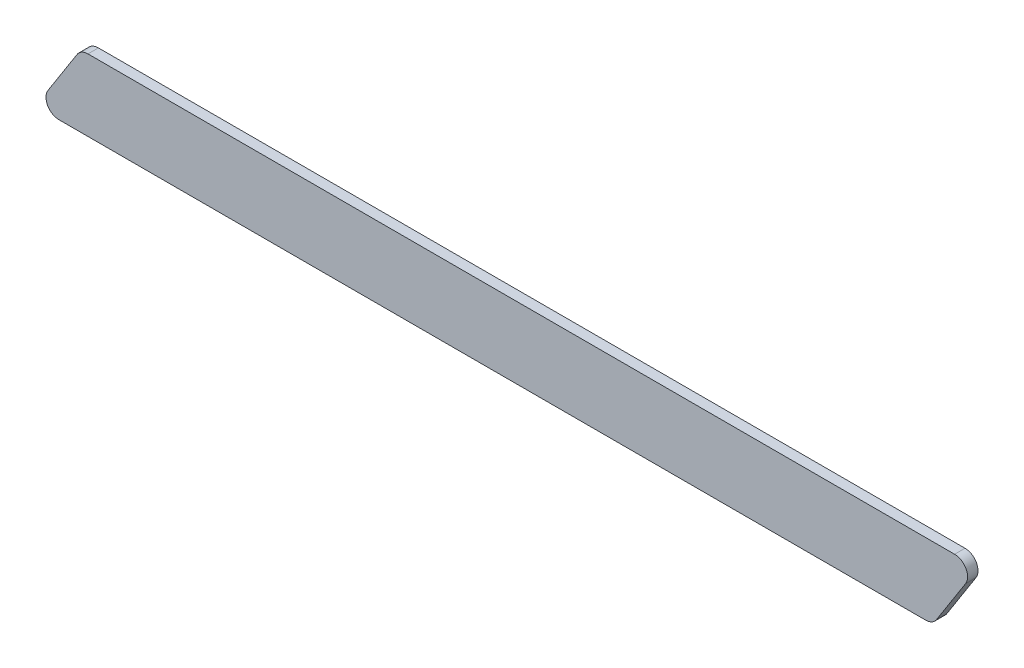
ISO-10303-21;
HEADER;
FILE_DESCRIPTION(('STEP AP214'),'2;1');
FILE_NAME('part.step','',(''),(''),'','','');
FILE_SCHEMA(('AUTOMOTIVE_DESIGN { 1 0 10303 214 1 1 1 1 }'));
ENDSEC;
DATA;
#1=APPLICATION_CONTEXT('core data for automotive mechanical design processes');
#2=APPLICATION_PROTOCOL_DEFINITION('international standard','automotive_design',2000,#1);
#3=PRODUCT_CONTEXT('',#1,'mechanical');
#4=PRODUCT('Part','Part','',(#3));
#5=PRODUCT_RELATED_PRODUCT_CATEGORY('part','',(#4));
#6=PRODUCT_DEFINITION_FORMATION('','',#4);
#7=PRODUCT_DEFINITION_CONTEXT('part definition',#1,'design');
#8=PRODUCT_DEFINITION('design','',#6,#7);
#9=PRODUCT_DEFINITION_SHAPE('','',#8);
#10=(LENGTH_UNIT() NAMED_UNIT(*) SI_UNIT(.MILLI.,.METRE.));
#11=(NAMED_UNIT(*) PLANE_ANGLE_UNIT() SI_UNIT($,.RADIAN.));
#12=(NAMED_UNIT(*) SI_UNIT($,.STERADIAN.) SOLID_ANGLE_UNIT());
#13=UNCERTAINTY_MEASURE_WITH_UNIT(LENGTH_MEASURE(1.E-05),#10,'distance_accuracy_value','');
#14=(GEOMETRIC_REPRESENTATION_CONTEXT(3) GLOBAL_UNCERTAINTY_ASSIGNED_CONTEXT((#13)) GLOBAL_UNIT_ASSIGNED_CONTEXT((#10,
#11,#12)) REPRESENTATION_CONTEXT('',''));
#15=CARTESIAN_POINT('',(0.,0.,0.));
#16=DIRECTION('',(0.,0.,1.));
#17=DIRECTION('',(1.,0.,0.));
#18=AXIS2_PLACEMENT_3D('',#15,#16,#17);
#19=CARTESIAN_POINT('',(-72.5,5.5,1.6));
#20=DIRECTION('',(0.,-1.,0.));
#21=DIRECTION('',(0.,0.,-1.));
#22=AXIS2_PLACEMENT_3D('',#19,#20,#21);
#23=PLANE('',#22);
#24=DIRECTION('',(-1.,0.,0.));
#25=VECTOR('',#24,1.);
#26=CARTESIAN_POINT('',(-72.5,5.5,1.6));
#27=LINE('',#26,#25);
#28=CARTESIAN_POINT('',(68.8566536708353,5.5,1.6));
#29=VERTEX_POINT('',#28);
#30=CARTESIAN_POINT('',(-64.4021082162899,5.5,1.6));
#31=VERTEX_POINT('',#30);
#32=EDGE_CURVE('E126',#29,#31,#27,.T.);
#33=ORIENTED_EDGE('',*,*,#32,.F.);
#34=DIRECTION('',(0.,0.,-1.));
#35=VECTOR('',#34,1.);
#36=CARTESIAN_POINT('',(68.8566536708353,5.5,1.6));
#37=LINE('',#36,#35);
#38=CARTESIAN_POINT('',(68.8566536708353,5.5,0.));
#39=VERTEX_POINT('',#38);
#40=EDGE_CURVE('E110',#29,#39,#37,.T.);
#41=ORIENTED_EDGE('',*,*,#40,.T.);
#42=DIRECTION('',(-1.,0.,0.));
#43=VECTOR('',#42,1.);
#44=CARTESIAN_POINT('',(-72.5,5.5,0.));
#45=LINE('',#44,#43);
#46=CARTESIAN_POINT('',(-64.4021082162899,5.5,0.));
#47=VERTEX_POINT('',#46);
#48=EDGE_CURVE('E123',#39,#47,#45,.T.);
#49=ORIENTED_EDGE('',*,*,#48,.T.);
#50=DIRECTION('',(0.,0.,1.));
#51=VECTOR('',#50,1.);
#52=CARTESIAN_POINT('',(-64.4021082162899,5.5,1.6));
#53=LINE('',#52,#51);
#54=EDGE_CURVE('E128',#47,#31,#53,.T.);
#55=ORIENTED_EDGE('',*,*,#54,.T.);
#56=EDGE_LOOP('',(#33,#41,#49,#55));
#57=FACE_BOUND('',#56,.T.);
#58=ADVANCED_FACE('F39',(#57),#23,.F.);
#59=CARTESIAN_POINT('',(-72.5,-5.5,1.6));
#60=DIRECTION('',(0.,1.,0.));
#61=DIRECTION('',(0.,0.,1.));
#62=AXIS2_PLACEMENT_3D('',#59,#60,#61);
#63=PLANE('',#62);
#64=DIRECTION('',(1.,0.,0.));
#65=VECTOR('',#64,1.);
#66=CARTESIAN_POINT('',(-72.5,-5.5,0.));
#67=LINE('',#66,#65);
#68=CARTESIAN_POINT('',(-68.8566536708354,-5.5,0.));
#69=VERTEX_POINT('',#68);
#70=CARTESIAN_POINT('',(64.4021082162899,-5.5,0.));
#71=VERTEX_POINT('',#70);
#72=EDGE_CURVE('E133',#69,#71,#67,.T.);
#73=ORIENTED_EDGE('',*,*,#72,.T.);
#74=DIRECTION('',(0.,0.,1.));
#75=VECTOR('',#74,1.);
#76=CARTESIAN_POINT('',(64.4021082162899,-5.5,1.6));
#77=LINE('',#76,#75);
#78=CARTESIAN_POINT('',(64.4021082162899,-5.5,1.6));
#79=VERTEX_POINT('',#78);
#80=EDGE_CURVE('E160',#71,#79,#77,.T.);
#81=ORIENTED_EDGE('',*,*,#80,.T.);
#82=DIRECTION('',(1.,0.,0.));
#83=VECTOR('',#82,1.);
#84=CARTESIAN_POINT('',(-72.5,-5.5,1.6));
#85=LINE('',#84,#83);
#86=CARTESIAN_POINT('',(-68.8566536708354,-5.5,1.6));
#87=VERTEX_POINT('',#86);
#88=EDGE_CURVE('E141',#87,#79,#85,.T.);
#89=ORIENTED_EDGE('',*,*,#88,.F.);
#90=DIRECTION('',(0.,0.,-1.));
#91=VECTOR('',#90,1.);
#92=CARTESIAN_POINT('',(-68.8566536708354,-5.5,1.6));
#93=LINE('',#92,#91);
#94=EDGE_CURVE('E157',#87,#69,#93,.T.);
#95=ORIENTED_EDGE('',*,*,#94,.T.);
#96=EDGE_LOOP('',(#73,#81,#89,#95));
#97=FACE_BOUND('',#96,.T.);
#98=ADVANCED_FACE('F182',(#97),#63,.F.);
#99=CARTESIAN_POINT('',(0.,0.,1.6));
#100=DIRECTION('',(0.,0.,-1.));
#101=DIRECTION('',(-1.,0.,0.));
#102=AXIS2_PLACEMENT_3D('',#99,#100,#101);
#103=PLANE('',#102);
#104=DIRECTION('',(-0.53687549219316,-0.843661487732107,0.));
#105=VECTOR('',#104,1.);
#106=CARTESIAN_POINT('',(72.5,5.5,1.6));
#107=LINE('',#106,#105);
#108=CARTESIAN_POINT('',(70.5439766462996,2.42624901561367,1.6));
#109=VERTEX_POINT('',#108);
#110=CARTESIAN_POINT('',(66.0894311917541,-4.57375098438633,1.6));
#111=VERTEX_POINT('',#110);
#112=EDGE_CURVE('E174',#109,#111,#107,.T.);
#113=ORIENTED_EDGE('',*,*,#112,.F.);
#114=CARTESIAN_POINT('',(68.8566536708353,3.5,1.6));
#115=DIRECTION('',(0.,0.,-1.));
#116=DIRECTION('',(-1.,0.,0.));
#117=AXIS2_PLACEMENT_3D('',#114,#115,#116);
#118=CIRCLE('',#117,2.);
#119=EDGE_CURVE('E155',#109,#29,#118,.F.);
#120=ORIENTED_EDGE('',*,*,#119,.T.);
#121=ORIENTED_EDGE('',*,*,#32,.T.);
#122=CARTESIAN_POINT('',(-64.4021082162899,3.5,1.6));
#123=DIRECTION('',(0.,0.,-1.));
#124=DIRECTION('',(-1.,0.,0.));
#125=AXIS2_PLACEMENT_3D('',#122,#123,#124);
#126=CIRCLE('',#125,2.);
#127=CARTESIAN_POINT('',(-66.0894311917542,4.57375098438633,1.6));
#128=VERTEX_POINT('',#127);
#129=EDGE_CURVE('E151',#31,#128,#126,.F.);
#130=ORIENTED_EDGE('',*,*,#129,.T.);
#131=DIRECTION('',(0.53687549219316,0.843661487732107,0.));
#132=VECTOR('',#131,1.);
#133=CARTESIAN_POINT('',(-72.5,-5.5,1.6));
#134=LINE('',#133,#132);
#135=CARTESIAN_POINT('',(-70.5439766462996,-2.42624901561368,1.6));
#136=VERTEX_POINT('',#135);
#137=EDGE_CURVE('E138',#136,#128,#134,.T.);
#138=ORIENTED_EDGE('',*,*,#137,.F.);
#139=CARTESIAN_POINT('',(-68.8566536708354,-3.5,1.6));
#140=DIRECTION('',(0.,0.,-1.));
#141=DIRECTION('',(-1.,0.,0.));
#142=AXIS2_PLACEMENT_3D('',#139,#140,#141);
#143=CIRCLE('',#142,2.);
#144=EDGE_CURVE('E62',#136,#87,#143,.F.);
#145=ORIENTED_EDGE('',*,*,#144,.T.);
#146=ORIENTED_EDGE('',*,*,#88,.T.);
#147=CARTESIAN_POINT('',(64.4021082162899,-3.5,1.6));
#148=DIRECTION('',(0.,0.,-1.));
#149=DIRECTION('',(-1.,0.,0.));
#150=AXIS2_PLACEMENT_3D('',#147,#148,#149);
#151=CIRCLE('',#150,2.);
#152=EDGE_CURVE('E54',#79,#111,#151,.F.);
#153=ORIENTED_EDGE('',*,*,#152,.T.);
#154=EDGE_LOOP('',(#113,#120,#121,#130,#138,#145,#146,#153));
#155=FACE_BOUND('',#154,.T.);
#156=ADVANCED_FACE('F170',(#155),#103,.F.);
#157=CARTESIAN_POINT('',(0.,0.,0.));
#158=DIRECTION('',(0.,0.,-1.));
#159=DIRECTION('',(-1.,0.,0.));
#160=AXIS2_PLACEMENT_3D('',#157,#158,#159);
#161=PLANE('',#160);
#162=ORIENTED_EDGE('',*,*,#48,.F.);
#163=CARTESIAN_POINT('',(68.8566536708353,3.5,0.));
#164=DIRECTION('',(0.,0.,-1.));
#165=DIRECTION('',(-1.,0.,0.));
#166=AXIS2_PLACEMENT_3D('',#163,#164,#165);
#167=CIRCLE('',#166,2.);
#168=CARTESIAN_POINT('',(70.5439766462996,2.42624901561367,0.));
#169=VERTEX_POINT('',#168);
#170=EDGE_CURVE('E106',#39,#169,#167,.T.);
#171=ORIENTED_EDGE('',*,*,#170,.T.);
#172=DIRECTION('',(-0.53687549219316,-0.843661487732107,0.));
#173=VECTOR('',#172,1.);
#174=CARTESIAN_POINT('',(72.5,5.5,0.));
#175=LINE('',#174,#173);
#176=CARTESIAN_POINT('',(66.0894311917541,-4.57375098438633,0.));
#177=VERTEX_POINT('',#176);
#178=EDGE_CURVE('E172',#169,#177,#175,.T.);
#179=ORIENTED_EDGE('',*,*,#178,.T.);
#180=CARTESIAN_POINT('',(64.4021082162899,-3.5,0.));
#181=DIRECTION('',(0.,0.,-1.));
#182=DIRECTION('',(-1.,0.,0.));
#183=AXIS2_PLACEMENT_3D('',#180,#181,#182);
#184=CIRCLE('',#183,2.);
#185=EDGE_CURVE('E117',#177,#71,#184,.T.);
#186=ORIENTED_EDGE('',*,*,#185,.T.);
#187=ORIENTED_EDGE('',*,*,#72,.F.);
#188=CARTESIAN_POINT('',(-68.8566536708354,-3.5,0.));
#189=DIRECTION('',(0.,0.,-1.));
#190=DIRECTION('',(-1.,0.,0.));
#191=AXIS2_PLACEMENT_3D('',#188,#189,#190);
#192=CIRCLE('',#191,2.);
#193=CARTESIAN_POINT('',(-70.5439766462996,-2.42624901561368,0.));
#194=VERTEX_POINT('',#193);
#195=EDGE_CURVE('E146',#69,#194,#192,.T.);
#196=ORIENTED_EDGE('',*,*,#195,.T.);
#197=DIRECTION('',(0.53687549219316,0.843661487732107,0.));
#198=VECTOR('',#197,1.);
#199=CARTESIAN_POINT('',(-72.5,-5.5,0.));
#200=LINE('',#199,#198);
#201=CARTESIAN_POINT('',(-66.0894311917542,4.57375098438633,0.));
#202=VERTEX_POINT('',#201);
#203=EDGE_CURVE('E134',#194,#202,#200,.T.);
#204=ORIENTED_EDGE('',*,*,#203,.T.);
#205=CARTESIAN_POINT('',(-64.4021082162899,3.5,0.));
#206=DIRECTION('',(0.,0.,-1.));
#207=DIRECTION('',(-1.,0.,0.));
#208=AXIS2_PLACEMENT_3D('',#205,#206,#207);
#209=CIRCLE('',#208,2.);
#210=EDGE_CURVE('E127',#202,#47,#209,.T.);
#211=ORIENTED_EDGE('',*,*,#210,.T.);
#212=EDGE_LOOP('',(#162,#171,#179,#186,#187,#196,#204,#211));
#213=FACE_BOUND('',#212,.T.);
#214=ADVANCED_FACE('F130',(#213),#161,.T.);
#215=CARTESIAN_POINT('',(72.5,5.5,0.));
#216=DIRECTION('',(-0.843661487732107,0.53687549219316,0.));
#217=DIRECTION('',(-0.53687549219316,-0.843661487732107,0.));
#218=AXIS2_PLACEMENT_3D('',#215,#216,#217);
#219=PLANE('',#218);
#220=ORIENTED_EDGE('',*,*,#178,.F.);
#221=DIRECTION('',(0.,0.,-1.));
#222=VECTOR('',#221,1.);
#223=CARTESIAN_POINT('',(70.5439766462996,2.42624901561367,0.));
#224=LINE('',#223,#222);
#225=EDGE_CURVE('E111',#169,#109,#224,.F.);
#226=ORIENTED_EDGE('',*,*,#225,.T.);
#227=ORIENTED_EDGE('',*,*,#112,.T.);
#228=DIRECTION('',(0.,0.,1.));
#229=VECTOR('',#228,1.);
#230=CARTESIAN_POINT('',(66.0894311917541,-4.57375098438633,0.));
#231=LINE('',#230,#229);
#232=EDGE_CURVE('E116',#111,#177,#231,.F.);
#233=ORIENTED_EDGE('',*,*,#232,.T.);
#234=EDGE_LOOP('',(#220,#226,#227,#233));
#235=FACE_BOUND('',#234,.T.);
#236=ADVANCED_FACE('F178',(#235),#219,.F.);
#237=CARTESIAN_POINT('',(-72.5,-5.5,0.));
#238=DIRECTION('',(0.843661487732107,-0.53687549219316,0.));
#239=DIRECTION('',(0.53687549219316,0.843661487732107,0.));
#240=AXIS2_PLACEMENT_3D('',#237,#238,#239);
#241=PLANE('',#240);
#242=ORIENTED_EDGE('',*,*,#203,.F.);
#243=DIRECTION('',(0.,0.,-1.));
#244=VECTOR('',#243,1.);
#245=CARTESIAN_POINT('',(-70.5439766462996,-2.42624901561368,0.));
#246=LINE('',#245,#244);
#247=EDGE_CURVE('E12',#194,#136,#246,.F.);
#248=ORIENTED_EDGE('',*,*,#247,.T.);
#249=ORIENTED_EDGE('',*,*,#137,.T.);
#250=DIRECTION('',(0.,0.,1.));
#251=VECTOR('',#250,1.);
#252=CARTESIAN_POINT('',(-66.0894311917542,4.57375098438633,0.));
#253=LINE('',#252,#251);
#254=EDGE_CURVE('E47',#128,#202,#253,.F.);
#255=ORIENTED_EDGE('',*,*,#254,.T.);
#256=EDGE_LOOP('',(#242,#248,#249,#255));
#257=FACE_BOUND('',#256,.T.);
#258=ADVANCED_FACE('F165',(#257),#241,.F.);
#259=CARTESIAN_POINT('',(68.8566536708353,3.5,1.6));
#260=DIRECTION('',(0.,0.,-1.));
#261=DIRECTION('',(-1.,0.,0.));
#262=AXIS2_PLACEMENT_3D('',#259,#260,#261);
#263=CYLINDRICAL_SURFACE('',#262,2.);
#264=ORIENTED_EDGE('',*,*,#119,.F.);
#265=ORIENTED_EDGE('',*,*,#225,.F.);
#266=ORIENTED_EDGE('',*,*,#170,.F.);
#267=ORIENTED_EDGE('',*,*,#40,.F.);
#268=EDGE_LOOP('',(#264,#265,#266,#267));
#269=FACE_BOUND('',#268,.T.);
#270=ADVANCED_FACE('F109',(#269),#263,.T.);
#271=CARTESIAN_POINT('',(64.4021082162899,-3.5,1.6));
#272=DIRECTION('',(0.,0.,1.));
#273=DIRECTION('',(1.,0.,0.));
#274=AXIS2_PLACEMENT_3D('',#271,#272,#273);
#275=CYLINDRICAL_SURFACE('',#274,2.);
#276=ORIENTED_EDGE('',*,*,#185,.F.);
#277=ORIENTED_EDGE('',*,*,#232,.F.);
#278=ORIENTED_EDGE('',*,*,#152,.F.);
#279=ORIENTED_EDGE('',*,*,#80,.F.);
#280=EDGE_LOOP('',(#276,#277,#278,#279));
#281=FACE_BOUND('',#280,.T.);
#282=ADVANCED_FACE('F180',(#281),#275,.T.);
#283=CARTESIAN_POINT('',(-68.8566536708354,-3.5,1.6));
#284=DIRECTION('',(0.,0.,-1.));
#285=DIRECTION('',(-1.,0.,0.));
#286=AXIS2_PLACEMENT_3D('',#283,#284,#285);
#287=CYLINDRICAL_SURFACE('',#286,2.);
#288=ORIENTED_EDGE('',*,*,#144,.F.);
#289=ORIENTED_EDGE('',*,*,#247,.F.);
#290=ORIENTED_EDGE('',*,*,#195,.F.);
#291=ORIENTED_EDGE('',*,*,#94,.F.);
#292=EDGE_LOOP('',(#288,#289,#290,#291));
#293=FACE_BOUND('',#292,.T.);
#294=ADVANCED_FACE('F185',(#293),#287,.T.);
#295=CARTESIAN_POINT('',(-64.4021082162899,3.5,1.6));
#296=DIRECTION('',(0.,0.,1.));
#297=DIRECTION('',(1.,0.,0.));
#298=AXIS2_PLACEMENT_3D('',#295,#296,#297);
#299=CYLINDRICAL_SURFACE('',#298,2.);
#300=ORIENTED_EDGE('',*,*,#210,.F.);
#301=ORIENTED_EDGE('',*,*,#254,.F.);
#302=ORIENTED_EDGE('',*,*,#129,.F.);
#303=ORIENTED_EDGE('',*,*,#54,.F.);
#304=EDGE_LOOP('',(#300,#301,#302,#303));
#305=FACE_BOUND('',#304,.T.);
#306=ADVANCED_FACE('F41',(#305),#299,.T.);
#307=CLOSED_SHELL('',(#58,#98,#156,#214,#236,#258,#270,#282,#294,#306));
#308=MANIFOLD_SOLID_BREP('B2',#307);
#309=ADVANCED_BREP_SHAPE_REPRESENTATION('',(#18,#308),#14);
#310=SHAPE_DEFINITION_REPRESENTATION(#9,#309);
ENDSEC;
END-ISO-10303-21;
